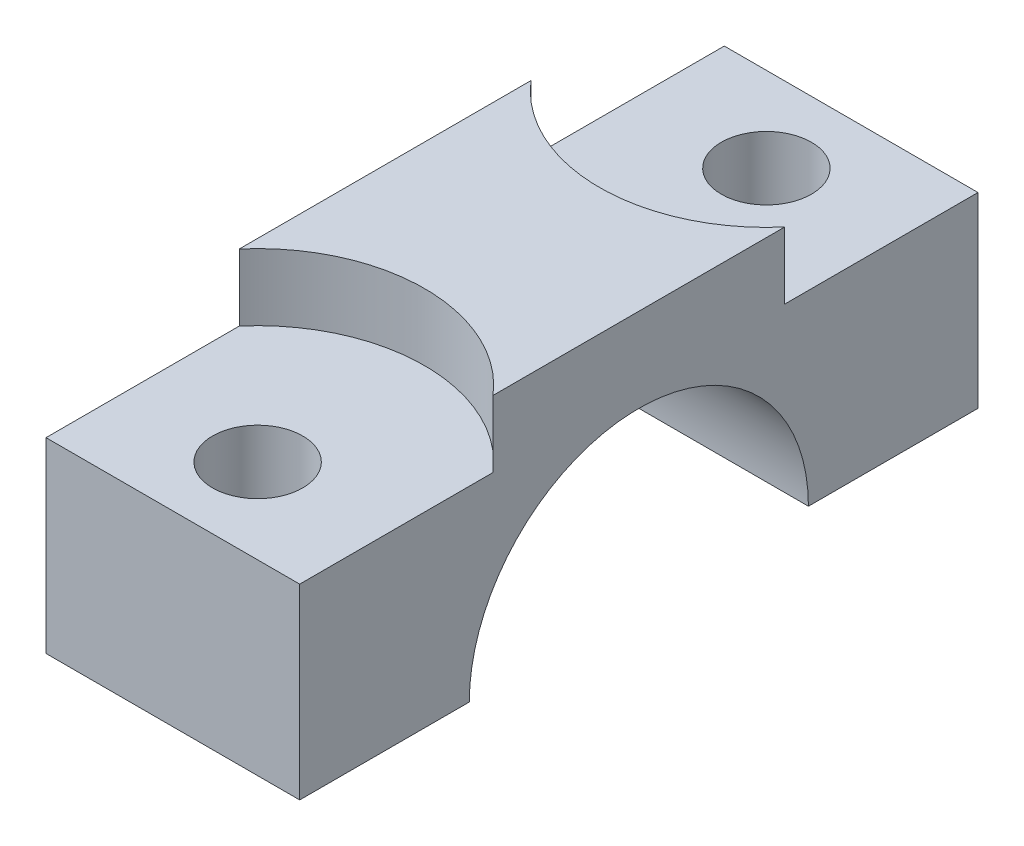
ISO-10303-21;
HEADER;
FILE_DESCRIPTION(('STEP AP214'),'2;1');
FILE_NAME('part.step','',(''),(''),'','','');
FILE_SCHEMA(('AUTOMOTIVE_DESIGN { 1 0 10303 214 1 1 1 1 }'));
ENDSEC;
DATA;
#1=APPLICATION_CONTEXT('core data for automotive mechanical design processes');
#2=APPLICATION_PROTOCOL_DEFINITION('international standard','automotive_design',2000,#1);
#3=PRODUCT_CONTEXT('',#1,'mechanical');
#4=PRODUCT('Part','Part','',(#3));
#5=PRODUCT_RELATED_PRODUCT_CATEGORY('part','',(#4));
#6=PRODUCT_DEFINITION_FORMATION('','',#4);
#7=PRODUCT_DEFINITION_CONTEXT('part definition',#1,'design');
#8=PRODUCT_DEFINITION('design','',#6,#7);
#9=PRODUCT_DEFINITION_SHAPE('','',#8);
#10=(LENGTH_UNIT() NAMED_UNIT(*) SI_UNIT(.MILLI.,.METRE.));
#11=(NAMED_UNIT(*) PLANE_ANGLE_UNIT() SI_UNIT($,.RADIAN.));
#12=(NAMED_UNIT(*) SI_UNIT($,.STERADIAN.) SOLID_ANGLE_UNIT());
#13=UNCERTAINTY_MEASURE_WITH_UNIT(LENGTH_MEASURE(1.E-05),#10,'distance_accuracy_value','');
#14=(GEOMETRIC_REPRESENTATION_CONTEXT(3) GLOBAL_UNCERTAINTY_ASSIGNED_CONTEXT((#13)) GLOBAL_UNIT_ASSIGNED_CONTEXT((#10,
#11,#12)) REPRESENTATION_CONTEXT('',''));
#15=CARTESIAN_POINT('',(0.,0.,0.));
#16=DIRECTION('',(0.,0.,1.));
#17=DIRECTION('',(1.,0.,0.));
#18=AXIS2_PLACEMENT_3D('',#15,#16,#17);
#19=CARTESIAN_POINT('',(9.5,19.,25.4));
#20=DIRECTION('',(0.,0.,-1.));
#21=DIRECTION('',(-1.,0.,0.));
#22=AXIS2_PLACEMENT_3D('',#19,#20,#21);
#23=PLANE('',#22);
#24=DIRECTION('',(0.,-1.,0.));
#25=VECTOR('',#24,1.);
#26=CARTESIAN_POINT('',(9.5,19.,25.4));
#27=LINE('',#26,#25);
#28=CARTESIAN_POINT('',(9.5,14.,25.4));
#29=VERTEX_POINT('',#28);
#30=CARTESIAN_POINT('',(9.5,0.,25.4));
#31=VERTEX_POINT('',#30);
#32=EDGE_CURVE('E175',#29,#31,#27,.T.);
#33=ORIENTED_EDGE('',*,*,#32,.F.);
#34=DIRECTION('',(-1.,0.,0.));
#35=VECTOR('',#34,1.);
#36=CARTESIAN_POINT('',(9.5,14.,25.4));
#37=LINE('',#36,#35);
#38=CARTESIAN_POINT('',(-9.5,14.,25.4));
#39=VERTEX_POINT('',#38);
#40=EDGE_CURVE('E65',#29,#39,#37,.T.);
#41=ORIENTED_EDGE('',*,*,#40,.T.);
#42=DIRECTION('',(0.,-1.,0.));
#43=VECTOR('',#42,1.);
#44=CARTESIAN_POINT('',(-9.5,19.,25.4));
#45=LINE('',#44,#43);
#46=CARTESIAN_POINT('',(-9.5,0.,25.4));
#47=VERTEX_POINT('',#46);
#48=EDGE_CURVE('E156',#39,#47,#45,.T.);
#49=ORIENTED_EDGE('',*,*,#48,.T.);
#50=DIRECTION('',(-1.,0.,0.));
#51=VECTOR('',#50,1.);
#52=CARTESIAN_POINT('',(9.5,0.,25.4));
#53=LINE('',#52,#51);
#54=EDGE_CURVE('E184',#31,#47,#53,.T.);
#55=ORIENTED_EDGE('',*,*,#54,.F.);
#56=EDGE_LOOP('',(#33,#41,#49,#55));
#57=FACE_BOUND('',#56,.T.);
#58=ADVANCED_FACE('F43',(#57),#23,.F.);
#59=CARTESIAN_POINT('',(9.5,0.,25.4));
#60=DIRECTION('',(0.,1.,0.));
#61=DIRECTION('',(0.,0.,1.));
#62=AXIS2_PLACEMENT_3D('',#59,#60,#61);
#63=PLANE('',#62);
#64=CARTESIAN_POINT('',(0.,0.,19.05));
#65=DIRECTION('',(0.,1.,0.));
#66=DIRECTION('',(0.,0.,1.));
#67=AXIS2_PLACEMENT_3D('',#64,#65,#66);
#68=CIRCLE('',#67,3.375);
#69=CARTESIAN_POINT('',(0.,0.,22.425));
#70=VERTEX_POINT('',#69);
#71=EDGE_CURVE('E217',#70,#70,#68,.T.);
#72=ORIENTED_EDGE('',*,*,#71,.T.);
#73=EDGE_LOOP('',(#72));
#74=FACE_BOUND('',#73,.T.);
#75=DIRECTION('',(0.,0.,-1.));
#76=VECTOR('',#75,1.);
#77=CARTESIAN_POINT('',(-9.5,0.,25.4));
#78=LINE('',#77,#76);
#79=CARTESIAN_POINT('',(-9.5,0.,12.7));
#80=VERTEX_POINT('',#79);
#81=EDGE_CURVE('E159',#47,#80,#78,.T.);
#82=ORIENTED_EDGE('',*,*,#81,.T.);
#83=DIRECTION('',(-1.,0.,0.));
#84=VECTOR('',#83,1.);
#85=CARTESIAN_POINT('',(9.5,0.,12.7));
#86=LINE('',#85,#84);
#87=CARTESIAN_POINT('',(9.5,0.,12.7));
#88=VERTEX_POINT('',#87);
#89=EDGE_CURVE('E180',#88,#80,#86,.T.);
#90=ORIENTED_EDGE('',*,*,#89,.F.);
#91=DIRECTION('',(0.,0.,-1.));
#92=VECTOR('',#91,1.);
#93=CARTESIAN_POINT('',(9.5,0.,25.4));
#94=LINE('',#93,#92);
#95=EDGE_CURVE('E223',#31,#88,#94,.T.);
#96=ORIENTED_EDGE('',*,*,#95,.F.);
#97=ORIENTED_EDGE('',*,*,#54,.T.);
#98=EDGE_LOOP('',(#82,#90,#96,#97));
#99=FACE_BOUND('',#98,.T.);
#100=ADVANCED_FACE('F256',(#74,#99),#63,.F.);
#101=CARTESIAN_POINT('',(9.5,0.,0.));
#102=DIRECTION('',(-1.,0.,0.));
#103=DIRECTION('',(0.,0.,1.));
#104=AXIS2_PLACEMENT_3D('',#101,#102,#103);
#105=CYLINDRICAL_SURFACE('',#104,12.7);
#106=CARTESIAN_POINT('',(-9.5,0.,0.));
#107=DIRECTION('',(-1.,0.,0.));
#108=DIRECTION('',(0.,0.,1.));
#109=AXIS2_PLACEMENT_3D('',#106,#107,#108);
#110=CIRCLE('',#109,12.7);
#111=CARTESIAN_POINT('',(-9.5,0.,-12.7));
#112=VERTEX_POINT('',#111);
#113=EDGE_CURVE('E163',#80,#112,#110,.T.);
#114=ORIENTED_EDGE('',*,*,#113,.T.);
#115=DIRECTION('',(-1.,0.,0.));
#116=VECTOR('',#115,1.);
#117=CARTESIAN_POINT('',(9.5,0.,-12.7));
#118=LINE('',#117,#116);
#119=CARTESIAN_POINT('',(9.5,0.,-12.7));
#120=VERTEX_POINT('',#119);
#121=EDGE_CURVE('E150',#120,#112,#118,.T.);
#122=ORIENTED_EDGE('',*,*,#121,.F.);
#123=CARTESIAN_POINT('',(9.5,0.,0.));
#124=DIRECTION('',(-1.,0.,0.));
#125=DIRECTION('',(0.,0.,1.));
#126=AXIS2_PLACEMENT_3D('',#123,#124,#125);
#127=CIRCLE('',#126,12.7);
#128=EDGE_CURVE('E226',#88,#120,#127,.T.);
#129=ORIENTED_EDGE('',*,*,#128,.F.);
#130=ORIENTED_EDGE('',*,*,#89,.T.);
#131=EDGE_LOOP('',(#114,#122,#129,#130));
#132=FACE_BOUND('',#131,.T.);
#133=ADVANCED_FACE('F278',(#132),#105,.F.);
#134=CARTESIAN_POINT('',(9.5,0.,-12.7));
#135=DIRECTION('',(0.,1.,0.));
#136=DIRECTION('',(0.,0.,1.));
#137=AXIS2_PLACEMENT_3D('',#134,#135,#136);
#138=PLANE('',#137);
#139=CARTESIAN_POINT('',(0.,0.,-19.05));
#140=DIRECTION('',(0.,1.,0.));
#141=DIRECTION('',(0.,0.,1.));
#142=AXIS2_PLACEMENT_3D('',#139,#140,#141);
#143=CIRCLE('',#142,3.375);
#144=CARTESIAN_POINT('',(0.,0.,-15.675));
#145=VERTEX_POINT('',#144);
#146=EDGE_CURVE('E137',#145,#145,#143,.T.);
#147=ORIENTED_EDGE('',*,*,#146,.T.);
#148=EDGE_LOOP('',(#147));
#149=FACE_BOUND('',#148,.T.);
#150=DIRECTION('',(0.,0.,-1.));
#151=VECTOR('',#150,1.);
#152=CARTESIAN_POINT('',(-9.5,0.,-12.7));
#153=LINE('',#152,#151);
#154=CARTESIAN_POINT('',(-9.5,0.,-25.4));
#155=VERTEX_POINT('',#154);
#156=EDGE_CURVE('E166',#112,#155,#153,.T.);
#157=ORIENTED_EDGE('',*,*,#156,.T.);
#158=DIRECTION('',(-1.,0.,0.));
#159=VECTOR('',#158,1.);
#160=CARTESIAN_POINT('',(9.5,0.,-25.4));
#161=LINE('',#160,#159);
#162=CARTESIAN_POINT('',(9.5,0.,-25.4));
#163=VERTEX_POINT('',#162);
#164=EDGE_CURVE('E144',#163,#155,#161,.T.);
#165=ORIENTED_EDGE('',*,*,#164,.F.);
#166=DIRECTION('',(0.,0.,-1.));
#167=VECTOR('',#166,1.);
#168=CARTESIAN_POINT('',(9.5,0.,-12.7));
#169=LINE('',#168,#167);
#170=EDGE_CURVE('E152',#120,#163,#169,.T.);
#171=ORIENTED_EDGE('',*,*,#170,.F.);
#172=ORIENTED_EDGE('',*,*,#121,.T.);
#173=EDGE_LOOP('',(#157,#165,#171,#172));
#174=FACE_BOUND('',#173,.T.);
#175=ADVANCED_FACE('F235',(#149,#174),#138,.F.);
#176=CARTESIAN_POINT('',(9.5,19.,-25.4));
#177=DIRECTION('',(0.,0.,1.));
#178=DIRECTION('',(0.,-1.,0.));
#179=AXIS2_PLACEMENT_3D('',#176,#177,#178);
#180=PLANE('',#179);
#181=DIRECTION('',(0.,1.,0.));
#182=VECTOR('',#181,1.);
#183=CARTESIAN_POINT('',(-9.5,19.,-25.4));
#184=LINE('',#183,#182);
#185=CARTESIAN_POINT('',(-9.5,14.,-25.4));
#186=VERTEX_POINT('',#185);
#187=EDGE_CURVE('E169',#155,#186,#184,.T.);
#188=ORIENTED_EDGE('',*,*,#187,.T.);
#189=DIRECTION('',(1.,0.,0.));
#190=VECTOR('',#189,1.);
#191=CARTESIAN_POINT('',(9.5,14.,-25.4));
#192=LINE('',#191,#190);
#193=CARTESIAN_POINT('',(9.5,14.,-25.4));
#194=VERTEX_POINT('',#193);
#195=EDGE_CURVE('E136',#186,#194,#192,.T.);
#196=ORIENTED_EDGE('',*,*,#195,.T.);
#197=DIRECTION('',(0.,1.,0.));
#198=VECTOR('',#197,1.);
#199=CARTESIAN_POINT('',(9.5,19.,-25.4));
#200=LINE('',#199,#198);
#201=EDGE_CURVE('E145',#163,#194,#200,.T.);
#202=ORIENTED_EDGE('',*,*,#201,.F.);
#203=ORIENTED_EDGE('',*,*,#164,.T.);
#204=EDGE_LOOP('',(#188,#196,#202,#203));
#205=FACE_BOUND('',#204,.T.);
#206=ADVANCED_FACE('F240',(#205),#180,.F.);
#207=CARTESIAN_POINT('',(9.5,19.,25.4));
#208=DIRECTION('',(0.,-1.,0.));
#209=DIRECTION('',(0.,0.,-1.));
#210=AXIS2_PLACEMENT_3D('',#207,#208,#209);
#211=PLANE('',#210);
#212=DIRECTION('',(0.,0.,1.));
#213=VECTOR('',#212,1.);
#214=CARTESIAN_POINT('',(9.5,19.,25.4));
#215=LINE('',#214,#213);
#216=CARTESIAN_POINT('',(9.5,19.,-10.925961595364));
#217=VERTEX_POINT('',#216);
#218=CARTESIAN_POINT('',(9.5,19.,10.925961595364));
#219=VERTEX_POINT('',#218);
#220=EDGE_CURVE('E131',#217,#219,#215,.T.);
#221=ORIENTED_EDGE('',*,*,#220,.F.);
#222=CARTESIAN_POINT('',(0.,19.,-19.05));
#223=DIRECTION('',(0.,1.,0.));
#224=DIRECTION('',(0.,0.,1.));
#225=AXIS2_PLACEMENT_3D('',#222,#223,#224);
#226=CIRCLE('',#225,12.5);
#227=CARTESIAN_POINT('',(-9.5,19.,-10.925961595364));
#228=VERTEX_POINT('',#227);
#229=EDGE_CURVE('E117',#228,#217,#226,.T.);
#230=ORIENTED_EDGE('',*,*,#229,.F.);
#231=DIRECTION('',(0.,0.,1.));
#232=VECTOR('',#231,1.);
#233=CARTESIAN_POINT('',(-9.5,19.,25.4));
#234=LINE('',#233,#232);
#235=CARTESIAN_POINT('',(-9.5,19.,10.925961595364));
#236=VERTEX_POINT('',#235);
#237=EDGE_CURVE('E173',#228,#236,#234,.T.);
#238=ORIENTED_EDGE('',*,*,#237,.T.);
#239=CARTESIAN_POINT('',(0.,19.,19.05));
#240=DIRECTION('',(0.,1.,0.));
#241=DIRECTION('',(0.,0.,1.));
#242=AXIS2_PLACEMENT_3D('',#239,#240,#241);
#243=CIRCLE('',#242,12.5);
#244=EDGE_CURVE('E142',#219,#236,#243,.T.);
#245=ORIENTED_EDGE('',*,*,#244,.F.);
#246=EDGE_LOOP('',(#221,#230,#238,#245));
#247=FACE_BOUND('',#246,.T.);
#248=ADVANCED_FACE('F140',(#247),#211,.F.);
#249=CARTESIAN_POINT('',(9.5,0.,0.));
#250=DIRECTION('',(-1.,0.,0.));
#251=DIRECTION('',(0.,0.,1.));
#252=AXIS2_PLACEMENT_3D('',#249,#250,#251);
#253=PLANE('',#252);
#254=DIRECTION('',(0.,0.,1.));
#255=VECTOR('',#254,1.);
#256=CARTESIAN_POINT('',(9.5,14.,0.));
#257=LINE('',#256,#255);
#258=CARTESIAN_POINT('',(9.5,14.,-10.925961595364));
#259=VERTEX_POINT('',#258);
#260=EDGE_CURVE('E134',#194,#259,#257,.T.);
#261=ORIENTED_EDGE('',*,*,#260,.T.);
#262=DIRECTION('',(0.,1.,0.));
#263=VECTOR('',#262,1.);
#264=CARTESIAN_POINT('',(9.5,19.,-10.925961595364));
#265=LINE('',#264,#263);
#266=EDGE_CURVE('E120',#259,#217,#265,.T.);
#267=ORIENTED_EDGE('',*,*,#266,.T.);
#268=ORIENTED_EDGE('',*,*,#220,.T.);
#269=DIRECTION('',(0.,1.,0.));
#270=VECTOR('',#269,1.);
#271=CARTESIAN_POINT('',(9.5,19.,10.925961595364));
#272=LINE('',#271,#270);
#273=CARTESIAN_POINT('',(9.5,14.,10.925961595364));
#274=VERTEX_POINT('',#273);
#275=EDGE_CURVE('E191',#219,#274,#272,.F.);
#276=ORIENTED_EDGE('',*,*,#275,.T.);
#277=DIRECTION('',(0.,0.,1.));
#278=VECTOR('',#277,1.);
#279=CARTESIAN_POINT('',(9.5,14.,0.));
#280=LINE('',#279,#278);
#281=EDGE_CURVE('E188',#274,#29,#280,.T.);
#282=ORIENTED_EDGE('',*,*,#281,.T.);
#283=ORIENTED_EDGE('',*,*,#32,.T.);
#284=ORIENTED_EDGE('',*,*,#95,.T.);
#285=ORIENTED_EDGE('',*,*,#128,.T.);
#286=ORIENTED_EDGE('',*,*,#170,.T.);
#287=ORIENTED_EDGE('',*,*,#201,.T.);
#288=EDGE_LOOP('',(#261,#267,#268,#276,#282,#283,#284,#285,#286,#287));
#289=FACE_BOUND('',#288,.T.);
#290=ADVANCED_FACE('F129',(#289),#253,.F.);
#291=CARTESIAN_POINT('',(-9.5,0.,0.));
#292=DIRECTION('',(-1.,0.,0.));
#293=DIRECTION('',(0.,0.,1.));
#294=AXIS2_PLACEMENT_3D('',#291,#292,#293);
#295=PLANE('',#294);
#296=DIRECTION('',(0.,0.,1.));
#297=VECTOR('',#296,1.);
#298=CARTESIAN_POINT('',(-9.5,14.,0.));
#299=LINE('',#298,#297);
#300=CARTESIAN_POINT('',(-9.5,14.,-10.925961595364));
#301=VERTEX_POINT('',#300);
#302=EDGE_CURVE('E11',#186,#301,#299,.T.);
#303=ORIENTED_EDGE('',*,*,#302,.F.);
#304=ORIENTED_EDGE('',*,*,#187,.F.);
#305=ORIENTED_EDGE('',*,*,#156,.F.);
#306=ORIENTED_EDGE('',*,*,#113,.F.);
#307=ORIENTED_EDGE('',*,*,#81,.F.);
#308=ORIENTED_EDGE('',*,*,#48,.F.);
#309=DIRECTION('',(0.,0.,1.));
#310=VECTOR('',#309,1.);
#311=CARTESIAN_POINT('',(-9.5,14.,0.));
#312=LINE('',#311,#310);
#313=CARTESIAN_POINT('',(-9.5,14.,10.925961595364));
#314=VERTEX_POINT('',#313);
#315=EDGE_CURVE('E160',#314,#39,#312,.T.);
#316=ORIENTED_EDGE('',*,*,#315,.F.);
#317=DIRECTION('',(0.,1.,0.));
#318=VECTOR('',#317,1.);
#319=CARTESIAN_POINT('',(-9.5,19.,10.925961595364));
#320=LINE('',#319,#318);
#321=EDGE_CURVE('E194',#236,#314,#320,.F.);
#322=ORIENTED_EDGE('',*,*,#321,.F.);
#323=ORIENTED_EDGE('',*,*,#237,.F.);
#324=DIRECTION('',(0.,1.,0.));
#325=VECTOR('',#324,1.);
#326=CARTESIAN_POINT('',(-9.5,19.,-10.925961595364));
#327=LINE('',#326,#325);
#328=EDGE_CURVE('E51',#301,#228,#327,.T.);
#329=ORIENTED_EDGE('',*,*,#328,.F.);
#330=EDGE_LOOP('',(#303,#304,#305,#306,#307,#308,#316,#322,#323,#329));
#331=FACE_BOUND('',#330,.T.);
#332=ADVANCED_FACE('F212',(#331),#295,.T.);
#333=CARTESIAN_POINT('',(0.,19.,19.05));
#334=DIRECTION('',(0.,1.,0.));
#335=DIRECTION('',(0.,0.,1.));
#336=AXIS2_PLACEMENT_3D('',#333,#334,#335);
#337=CYLINDRICAL_SURFACE('',#336,12.5);
#338=ORIENTED_EDGE('',*,*,#244,.T.);
#339=ORIENTED_EDGE('',*,*,#321,.T.);
#340=CARTESIAN_POINT('',(0.,14.,19.05));
#341=DIRECTION('',(0.,1.,0.));
#342=DIRECTION('',(0.,0.,1.));
#343=AXIS2_PLACEMENT_3D('',#340,#341,#342);
#344=CIRCLE('',#343,12.5);
#345=EDGE_CURVE('E202',#274,#314,#344,.T.);
#346=ORIENTED_EDGE('',*,*,#345,.F.);
#347=ORIENTED_EDGE('',*,*,#275,.F.);
#348=EDGE_LOOP('',(#338,#339,#346,#347));
#349=FACE_BOUND('',#348,.T.);
#350=ADVANCED_FACE('F201',(#349),#337,.F.);
#351=CARTESIAN_POINT('',(0.,19.,19.05));
#352=DIRECTION('',(0.,1.,0.));
#353=DIRECTION('',(0.,0.,1.));
#354=AXIS2_PLACEMENT_3D('',#351,#352,#353);
#355=CYLINDRICAL_SURFACE('',#354,3.375);
#356=ORIENTED_EDGE('',*,*,#71,.F.);
#357=EDGE_LOOP('',(#356));
#358=FACE_BOUND('',#357,.T.);
#359=CARTESIAN_POINT('',(0.,14.,19.05));
#360=DIRECTION('',(0.,1.,0.));
#361=DIRECTION('',(0.,0.,1.));
#362=AXIS2_PLACEMENT_3D('',#359,#360,#361);
#363=CIRCLE('',#362,3.375);
#364=CARTESIAN_POINT('',(0.,14.,22.425));
#365=VERTEX_POINT('',#364);
#366=EDGE_CURVE('E208',#365,#365,#363,.T.);
#367=ORIENTED_EDGE('',*,*,#366,.T.);
#368=EDGE_LOOP('',(#367));
#369=FACE_BOUND('',#368,.T.);
#370=ADVANCED_FACE('F259',(#358,#369),#355,.F.);
#371=CARTESIAN_POINT('',(3.375,14.,19.05));
#372=DIRECTION('',(0.,-1.,0.));
#373=DIRECTION('',(0.,0.,-1.));
#374=AXIS2_PLACEMENT_3D('',#371,#372,#373);
#375=PLANE('',#374);
#376=ORIENTED_EDGE('',*,*,#315,.T.);
#377=ORIENTED_EDGE('',*,*,#40,.F.);
#378=ORIENTED_EDGE('',*,*,#281,.F.);
#379=ORIENTED_EDGE('',*,*,#345,.T.);
#380=EDGE_LOOP('',(#376,#377,#378,#379));
#381=FACE_BOUND('',#380,.T.);
#382=ORIENTED_EDGE('',*,*,#366,.F.);
#383=EDGE_LOOP('',(#382));
#384=FACE_BOUND('',#383,.T.);
#385=ADVANCED_FACE('F205',(#381,#384),#375,.F.);
#386=CARTESIAN_POINT('',(3.375,14.,-19.05));
#387=DIRECTION('',(0.,-1.,0.));
#388=DIRECTION('',(0.,0.,-1.));
#389=AXIS2_PLACEMENT_3D('',#386,#387,#388);
#390=PLANE('',#389);
#391=CARTESIAN_POINT('',(0.,14.,-19.05));
#392=DIRECTION('',(0.,1.,0.));
#393=DIRECTION('',(0.,0.,1.));
#394=AXIS2_PLACEMENT_3D('',#391,#392,#393);
#395=CIRCLE('',#394,3.375);
#396=CARTESIAN_POINT('',(0.,14.,-15.675));
#397=VERTEX_POINT('',#396);
#398=EDGE_CURVE('E286',#397,#397,#395,.T.);
#399=ORIENTED_EDGE('',*,*,#398,.F.);
#400=EDGE_LOOP('',(#399));
#401=FACE_BOUND('',#400,.T.);
#402=ORIENTED_EDGE('',*,*,#195,.F.);
#403=ORIENTED_EDGE('',*,*,#302,.T.);
#404=CARTESIAN_POINT('',(0.,14.,-19.05));
#405=DIRECTION('',(0.,1.,0.));
#406=DIRECTION('',(0.,0.,1.));
#407=AXIS2_PLACEMENT_3D('',#404,#405,#406);
#408=CIRCLE('',#407,12.5);
#409=EDGE_CURVE('E58',#301,#259,#408,.T.);
#410=ORIENTED_EDGE('',*,*,#409,.T.);
#411=ORIENTED_EDGE('',*,*,#260,.F.);
#412=EDGE_LOOP('',(#402,#403,#410,#411));
#413=FACE_BOUND('',#412,.T.);
#414=ADVANCED_FACE('F265',(#401,#413),#390,.F.);
#415=CARTESIAN_POINT('',(0.,19.,-19.05));
#416=DIRECTION('',(0.,1.,0.));
#417=DIRECTION('',(0.,0.,1.));
#418=AXIS2_PLACEMENT_3D('',#415,#416,#417);
#419=CYLINDRICAL_SURFACE('',#418,12.5);
#420=ORIENTED_EDGE('',*,*,#409,.F.);
#421=ORIENTED_EDGE('',*,*,#328,.T.);
#422=ORIENTED_EDGE('',*,*,#229,.T.);
#423=ORIENTED_EDGE('',*,*,#266,.F.);
#424=EDGE_LOOP('',(#420,#421,#422,#423));
#425=FACE_BOUND('',#424,.T.);
#426=ADVANCED_FACE('F119',(#425),#419,.F.);
#427=CARTESIAN_POINT('',(0.,19.,-19.05));
#428=DIRECTION('',(0.,1.,0.));
#429=DIRECTION('',(0.,0.,1.));
#430=AXIS2_PLACEMENT_3D('',#427,#428,#429);
#431=CYLINDRICAL_SURFACE('',#430,3.375);
#432=ORIENTED_EDGE('',*,*,#146,.F.);
#433=EDGE_LOOP('',(#432));
#434=FACE_BOUND('',#433,.T.);
#435=ORIENTED_EDGE('',*,*,#398,.T.);
#436=EDGE_LOOP('',(#435));
#437=FACE_BOUND('',#436,.T.);
#438=ADVANCED_FACE('F296',(#434,#437),#431,.F.);
#439=CLOSED_SHELL('',(#58,#100,#133,#175,#206,#248,#290,#332,#350,#370,#385,#414,#426,#438));
#440=MANIFOLD_SOLID_BREP('B2',#439);
#441=ADVANCED_BREP_SHAPE_REPRESENTATION('',(#18,#440),#14);
#442=SHAPE_DEFINITION_REPRESENTATION(#9,#441);
ENDSEC;
END-ISO-10303-21;
